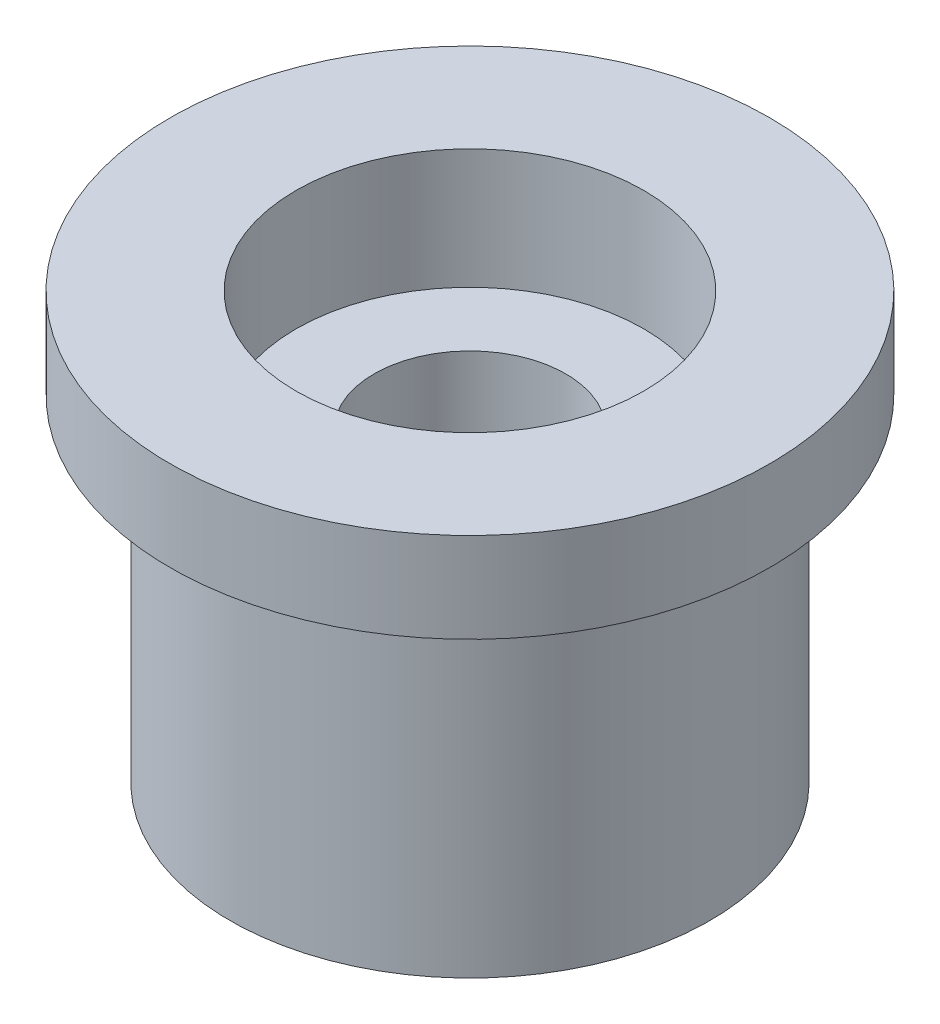
ISO-10303-21;
HEADER;
FILE_DESCRIPTION(('STEP AP214'),'2;1');
FILE_NAME('part.step','',(''),(''),'','','');
FILE_SCHEMA(('AUTOMOTIVE_DESIGN { 1 0 10303 214 1 1 1 1 }'));
ENDSEC;
DATA;
#1=APPLICATION_CONTEXT('core data for automotive mechanical design processes');
#2=APPLICATION_PROTOCOL_DEFINITION('international standard','automotive_design',2000,#1);
#3=PRODUCT_CONTEXT('',#1,'mechanical');
#4=PRODUCT('Part','Part','',(#3));
#5=PRODUCT_RELATED_PRODUCT_CATEGORY('part','',(#4));
#6=PRODUCT_DEFINITION_FORMATION('','',#4);
#7=PRODUCT_DEFINITION_CONTEXT('part definition',#1,'design');
#8=PRODUCT_DEFINITION('design','',#6,#7);
#9=PRODUCT_DEFINITION_SHAPE('','',#8);
#10=(LENGTH_UNIT() NAMED_UNIT(*) SI_UNIT(.MILLI.,.METRE.));
#11=(NAMED_UNIT(*) PLANE_ANGLE_UNIT() SI_UNIT($,.RADIAN.));
#12=(NAMED_UNIT(*) SI_UNIT($,.STERADIAN.) SOLID_ANGLE_UNIT());
#13=UNCERTAINTY_MEASURE_WITH_UNIT(LENGTH_MEASURE(1.E-05),#10,'distance_accuracy_value','');
#14=(GEOMETRIC_REPRESENTATION_CONTEXT(3) GLOBAL_UNCERTAINTY_ASSIGNED_CONTEXT((#13)) GLOBAL_UNIT_ASSIGNED_CONTEXT((#10,
#11,#12)) REPRESENTATION_CONTEXT('',''));
#15=CARTESIAN_POINT('',(0.,0.,0.));
#16=DIRECTION('',(0.,0.,1.));
#17=DIRECTION('',(1.,0.,0.));
#18=AXIS2_PLACEMENT_3D('',#15,#16,#17);
#19=CARTESIAN_POINT('',(0.,5.6,0.));
#20=DIRECTION('',(0.,-1.,0.));
#21=DIRECTION('',(0.,0.,-1.));
#22=AXIS2_PLACEMENT_3D('',#19,#20,#21);
#23=PLANE('',#22);
#24=CARTESIAN_POINT('',(0.,5.6,0.));
#25=DIRECTION('',(0.,-1.,0.));
#26=DIRECTION('',(0.,0.,-1.));
#27=AXIS2_PLACEMENT_3D('',#24,#25,#26);
#28=CIRCLE('',#27,5.);
#29=CARTESIAN_POINT('',(0.,5.6,-5.));
#30=VERTEX_POINT('',#29);
#31=EDGE_CURVE('E41',#30,#30,#28,.T.);
#32=ORIENTED_EDGE('',*,*,#31,.T.);
#33=EDGE_LOOP('',(#32));
#34=FACE_BOUND('',#33,.T.);
#35=CARTESIAN_POINT('',(0.,5.6,0.));
#36=DIRECTION('',(0.,-1.,0.));
#37=DIRECTION('',(0.,0.,-1.));
#38=AXIS2_PLACEMENT_3D('',#35,#36,#37);
#39=CIRCLE('',#38,4.);
#40=CARTESIAN_POINT('',(0.,5.6,-4.));
#41=VERTEX_POINT('',#40);
#42=EDGE_CURVE('E219',#41,#41,#39,.T.);
#43=ORIENTED_EDGE('',*,*,#42,.F.);
#44=EDGE_LOOP('',(#43));
#45=FACE_BOUND('',#44,.T.);
#46=ADVANCED_FACE('F33',(#34,#45),#23,.T.);
#47=CARTESIAN_POINT('',(0.,7.1,0.));
#48=DIRECTION('',(0.,-1.,0.));
#49=DIRECTION('',(0.,0.,-1.));
#50=AXIS2_PLACEMENT_3D('',#47,#48,#49);
#51=CYLINDRICAL_SURFACE('',#50,5.);
#52=CARTESIAN_POINT('',(0.,7.1,0.));
#53=DIRECTION('',(0.,-1.,0.));
#54=DIRECTION('',(0.,0.,-1.));
#55=AXIS2_PLACEMENT_3D('',#52,#53,#54);
#56=CIRCLE('',#55,5.);
#57=CARTESIAN_POINT('',(0.,7.1,-5.));
#58=VERTEX_POINT('',#57);
#59=EDGE_CURVE('E11',#58,#58,#56,.T.);
#60=ORIENTED_EDGE('',*,*,#59,.T.);
#61=EDGE_LOOP('',(#60));
#62=FACE_BOUND('',#61,.T.);
#63=ORIENTED_EDGE('',*,*,#31,.F.);
#64=EDGE_LOOP('',(#63));
#65=FACE_BOUND('',#64,.T.);
#66=ADVANCED_FACE('F35',(#62,#65),#51,.T.);
#67=CARTESIAN_POINT('',(5.,7.1,0.));
#68=DIRECTION('',(0.,1.,0.));
#69=DIRECTION('',(0.,0.,1.));
#70=AXIS2_PLACEMENT_3D('',#67,#68,#69);
#71=PLANE('',#70);
#72=CARTESIAN_POINT('',(0.,7.1,0.));
#73=DIRECTION('',(0.,1.,0.));
#74=DIRECTION('',(0.,0.,1.));
#75=AXIS2_PLACEMENT_3D('',#72,#73,#74);
#76=CIRCLE('',#75,2.9);
#77=CARTESIAN_POINT('',(0.,7.1,2.9));
#78=VERTEX_POINT('',#77);
#79=EDGE_CURVE('E329',#78,#78,#76,.T.);
#80=ORIENTED_EDGE('',*,*,#79,.F.);
#81=EDGE_LOOP('',(#80));
#82=FACE_BOUND('',#81,.T.);
#83=ORIENTED_EDGE('',*,*,#59,.F.);
#84=EDGE_LOOP('',(#83));
#85=FACE_BOUND('',#84,.T.);
#86=ADVANCED_FACE('F236',(#82,#85),#71,.T.);
#87=CARTESIAN_POINT('',(0.,0.,0.));
#88=DIRECTION('',(0.,1.,0.));
#89=DIRECTION('',(0.,0.,1.));
#90=AXIS2_PLACEMENT_3D('',#87,#88,#89);
#91=CYLINDRICAL_SURFACE('',#90,4.);
#92=CARTESIAN_POINT('',(0.,0.,0.));
#93=DIRECTION('',(0.,-1.,0.));
#94=DIRECTION('',(0.,0.,-1.));
#95=AXIS2_PLACEMENT_3D('',#92,#93,#94);
#96=CIRCLE('',#95,4.);
#97=CARTESIAN_POINT('',(0.,0.,-4.));
#98=VERTEX_POINT('',#97);
#99=EDGE_CURVE('E226',#98,#98,#96,.T.);
#100=ORIENTED_EDGE('',*,*,#99,.F.);
#101=EDGE_LOOP('',(#100));
#102=FACE_BOUND('',#101,.T.);
#103=ORIENTED_EDGE('',*,*,#42,.T.);
#104=EDGE_LOOP('',(#103));
#105=FACE_BOUND('',#104,.T.);
#106=ADVANCED_FACE('F242',(#102,#105),#91,.T.);
#107=CARTESIAN_POINT('',(0.,0.,0.));
#108=DIRECTION('',(0.,-1.,0.));
#109=DIRECTION('',(0.,0.,-1.));
#110=AXIS2_PLACEMENT_3D('',#107,#108,#109);
#111=PLANE('',#110);
#112=CARTESIAN_POINT('',(0.,0.,0.));
#113=DIRECTION('',(0.,1.,0.));
#114=DIRECTION('',(0.,0.,1.));
#115=AXIS2_PLACEMENT_3D('',#112,#113,#114);
#116=CIRCLE('',#115,1.60000000000001);
#117=CARTESIAN_POINT('',(0.,0.,1.60000000000001));
#118=VERTEX_POINT('',#117);
#119=EDGE_CURVE('E148',#118,#118,#116,.T.);
#120=ORIENTED_EDGE('',*,*,#119,.T.);
#121=EDGE_LOOP('',(#120));
#122=FACE_BOUND('',#121,.T.);
#123=CARTESIAN_POINT('',(-1.02515075142256E-13,0.,0.));
#124=DIRECTION('',(0.,-1.,0.));
#125=DIRECTION('',(0.,0.,-1.));
#126=AXIS2_PLACEMENT_3D('',#123,#124,#125);
#127=CIRCLE('',#126,3.09999999999998);
#128=CARTESIAN_POINT('',(-1.88345277640779,0.,2.46223590239489));
#129=VERTEX_POINT('',#128);
#130=CARTESIAN_POINT('',(-1.88345277640771,0.,-2.46223590239483));
#131=VERTEX_POINT('',#130);
#132=EDGE_CURVE('E48',#129,#131,#127,.T.);
#133=ORIENTED_EDGE('',*,*,#132,.F.);
#134=DIRECTION('',(-0.500000000000124,0.,0.866025403784367));
#135=VECTOR('',#134,1.);
#136=CARTESIAN_POINT('',(-1.47888532680438,0.,1.76150452459345));
#137=LINE('',#136,#135);
#138=CARTESIAN_POINT('',(-1.47888532680438,0.,1.76150452459345));
#139=VERTEX_POINT('',#138);
#140=EDGE_CURVE('E142',#139,#129,#137,.T.);
#141=ORIENTED_EDGE('',*,*,#140,.F.);
#142=CARTESIAN_POINT('',(-1.02515075142256E-13,0.,0.));
#143=DIRECTION('',(0.,1.,0.));
#144=DIRECTION('',(0.,0.,1.));
#145=AXIS2_PLACEMENT_3D('',#142,#143,#144);
#146=CIRCLE('',#145,2.3);
#147=CARTESIAN_POINT('',(-1.4788853268044,0.,-1.76150452459332));
#148=VERTEX_POINT('',#147);
#149=EDGE_CURVE('E145',#148,#139,#146,.T.);
#150=ORIENTED_EDGE('',*,*,#149,.F.);
#151=DIRECTION('',(0.5,0.,0.866025403784439));
#152=VECTOR('',#151,1.);
#153=CARTESIAN_POINT('',(-1.88345277640771,0.,-2.46223590239483));
#154=LINE('',#153,#152);
#155=EDGE_CURVE('E154',#131,#148,#154,.T.);
#156=ORIENTED_EDGE('',*,*,#155,.F.);
#157=EDGE_LOOP('',(#133,#141,#150,#156));
#158=FACE_BOUND('',#157,.T.);
#159=CARTESIAN_POINT('',(0.,0.,0.));
#160=DIRECTION('',(0.,1.,0.));
#161=DIRECTION('',(0.,0.,1.));
#162=AXIS2_PLACEMENT_3D('',#159,#160,#161);
#163=CIRCLE('',#162,2.3);
#164=CARTESIAN_POINT('',(2.26495033058122,0.,-0.400000000000019));
#165=VERTEX_POINT('',#164);
#166=CARTESIAN_POINT('',(-0.786065003776926,0.,-2.16150452459327));
#167=VERTEX_POINT('',#166);
#168=EDGE_CURVE('E56',#165,#167,#163,.T.);
#169=ORIENTED_EDGE('',*,*,#168,.F.);
#170=DIRECTION('',(-1.,0.,0.));
#171=VECTOR('',#170,1.);
#172=CARTESIAN_POINT('',(3.07408522978788,0.,-0.399999999999992));
#173=LINE('',#172,#171);
#174=CARTESIAN_POINT('',(3.07408522978788,0.,-0.399999999999993));
#175=VERTEX_POINT('',#174);
#176=EDGE_CURVE('E167',#175,#165,#173,.T.);
#177=ORIENTED_EDGE('',*,*,#176,.F.);
#178=CARTESIAN_POINT('',(0.,0.,0.));
#179=DIRECTION('',(0.,-1.,0.));
#180=DIRECTION('',(0.,0.,-1.));
#181=AXIS2_PLACEMENT_3D('',#178,#179,#180);
#182=CIRCLE('',#181,3.1);
#183=CARTESIAN_POINT('',(-1.19063245338013,0.,-2.86223590239484));
#184=VERTEX_POINT('',#183);
#185=EDGE_CURVE('E181',#184,#175,#182,.T.);
#186=ORIENTED_EDGE('',*,*,#185,.F.);
#187=DIRECTION('',(-0.499999999999857,0.,-0.866025403784521));
#188=VECTOR('',#187,1.);
#189=CARTESIAN_POINT('',(-0.786065003776927,0.,-2.16150452459327));
#190=LINE('',#189,#188);
#191=EDGE_CURVE('E178',#167,#184,#190,.T.);
#192=ORIENTED_EDGE('',*,*,#191,.F.);
#193=EDGE_LOOP('',(#169,#177,#186,#192));
#194=FACE_BOUND('',#193,.T.);
#195=CARTESIAN_POINT('',(0.,0.,0.));
#196=DIRECTION('',(0.,-1.,0.));
#197=DIRECTION('',(0.,0.,-1.));
#198=AXIS2_PLACEMENT_3D('',#195,#196,#197);
#199=CIRCLE('',#198,3.1);
#200=CARTESIAN_POINT('',(3.07408522978788,0.,0.399999999999992));
#201=VERTEX_POINT('',#200);
#202=CARTESIAN_POINT('',(-1.19063245337983,0.,2.86223590239497));
#203=VERTEX_POINT('',#202);
#204=EDGE_CURVE('E188',#201,#203,#199,.T.);
#205=ORIENTED_EDGE('',*,*,#204,.F.);
#206=DIRECTION('',(1.,0.,0.));
#207=VECTOR('',#206,1.);
#208=CARTESIAN_POINT('',(2.26495033058122,0.,0.400000000000019));
#209=LINE('',#208,#207);
#210=CARTESIAN_POINT('',(2.26495033058122,0.,0.40000000000002));
#211=VERTEX_POINT('',#210);
#212=EDGE_CURVE('E198',#211,#201,#209,.T.);
#213=ORIENTED_EDGE('',*,*,#212,.F.);
#214=CARTESIAN_POINT('',(0.,0.,0.));
#215=DIRECTION('',(0.,1.,0.));
#216=DIRECTION('',(0.,0.,1.));
#217=AXIS2_PLACEMENT_3D('',#214,#215,#216);
#218=CIRCLE('',#217,2.3);
#219=CARTESIAN_POINT('',(-0.786065003776618,0.,2.16150452459338));
#220=VERTEX_POINT('',#219);
#221=EDGE_CURVE('E212',#220,#211,#218,.T.);
#222=ORIENTED_EDGE('',*,*,#221,.F.);
#223=DIRECTION('',(0.499999999999856,0.,-0.866025403784522));
#224=VECTOR('',#223,1.);
#225=CARTESIAN_POINT('',(-1.19063245337983,0.,2.86223590239497));
#226=LINE('',#225,#224);
#227=EDGE_CURVE('E209',#203,#220,#226,.T.);
#228=ORIENTED_EDGE('',*,*,#227,.F.);
#229=EDGE_LOOP('',(#205,#213,#222,#228));
#230=FACE_BOUND('',#229,.T.);
#231=ORIENTED_EDGE('',*,*,#99,.T.);
#232=EDGE_LOOP('',(#231));
#233=FACE_BOUND('',#232,.T.);
#234=ADVANCED_FACE('F252',(#122,#158,#194,#230,#233),#111,.T.);
#235=CARTESIAN_POINT('',(0.,4.3,0.));
#236=DIRECTION('',(0.,-1.,0.));
#237=DIRECTION('',(0.,0.,-1.));
#238=AXIS2_PLACEMENT_3D('',#235,#236,#237);
#239=CYLINDRICAL_SURFACE('',#238,3.1);
#240=ORIENTED_EDGE('',*,*,#204,.T.);
#241=DIRECTION('',(0.,-1.,0.));
#242=VECTOR('',#241,1.);
#243=CARTESIAN_POINT('',(-1.19063245337983,4.3,2.86223590239497));
#244=LINE('',#243,#242);
#245=CARTESIAN_POINT('',(-1.19063245337983,4.3,2.86223590239497));
#246=VERTEX_POINT('',#245);
#247=EDGE_CURVE('E207',#246,#203,#244,.T.);
#248=ORIENTED_EDGE('',*,*,#247,.F.);
#249=CARTESIAN_POINT('',(0.,4.3,0.));
#250=DIRECTION('',(0.,-1.,0.));
#251=DIRECTION('',(0.,0.,-1.));
#252=AXIS2_PLACEMENT_3D('',#249,#250,#251);
#253=CIRCLE('',#252,3.1);
#254=CARTESIAN_POINT('',(3.07408522978788,4.3,0.399999999999992));
#255=VERTEX_POINT('',#254);
#256=EDGE_CURVE('E194',#255,#246,#253,.T.);
#257=ORIENTED_EDGE('',*,*,#256,.F.);
#258=DIRECTION('',(0.,-1.,0.));
#259=VECTOR('',#258,1.);
#260=CARTESIAN_POINT('',(3.07408522978788,4.3,0.399999999999992));
#261=LINE('',#260,#259);
#262=EDGE_CURVE('E217',#255,#201,#261,.T.);
#263=ORIENTED_EDGE('',*,*,#262,.T.);
#264=EDGE_LOOP('',(#240,#248,#257,#263));
#265=FACE_BOUND('',#264,.T.);
#266=ADVANCED_FACE('F256',(#265),#239,.F.);
#267=CARTESIAN_POINT('',(2.26495033058122,4.3,0.400000000000019));
#268=DIRECTION('',(0.,0.,-1.));
#269=DIRECTION('',(-1.,0.,0.));
#270=AXIS2_PLACEMENT_3D('',#267,#268,#269);
#271=PLANE('',#270);
#272=ORIENTED_EDGE('',*,*,#212,.T.);
#273=ORIENTED_EDGE('',*,*,#262,.F.);
#274=DIRECTION('',(1.,0.,0.));
#275=VECTOR('',#274,1.);
#276=CARTESIAN_POINT('',(2.26495033058122,4.3,0.400000000000019));
#277=LINE('',#276,#275);
#278=CARTESIAN_POINT('',(2.26495033058122,4.3,0.40000000000002));
#279=VERTEX_POINT('',#278);
#280=EDGE_CURVE('E204',#279,#255,#277,.T.);
#281=ORIENTED_EDGE('',*,*,#280,.F.);
#282=DIRECTION('',(0.,-1.,0.));
#283=VECTOR('',#282,1.);
#284=CARTESIAN_POINT('',(2.26495033058122,4.3,0.40000000000002));
#285=LINE('',#284,#283);
#286=EDGE_CURVE('E220',#279,#211,#285,.T.);
#287=ORIENTED_EDGE('',*,*,#286,.T.);
#288=EDGE_LOOP('',(#272,#273,#281,#287));
#289=FACE_BOUND('',#288,.T.);
#290=ADVANCED_FACE('F260',(#289),#271,.F.);
#291=CARTESIAN_POINT('',(0.,4.3,0.));
#292=DIRECTION('',(0.,-1.,0.));
#293=DIRECTION('',(0.,0.,-1.));
#294=AXIS2_PLACEMENT_3D('',#291,#292,#293);
#295=CYLINDRICAL_SURFACE('',#294,2.3);
#296=ORIENTED_EDGE('',*,*,#221,.T.);
#297=ORIENTED_EDGE('',*,*,#286,.F.);
#298=CARTESIAN_POINT('',(0.,4.3,0.));
#299=DIRECTION('',(0.,1.,0.));
#300=DIRECTION('',(0.,0.,1.));
#301=AXIS2_PLACEMENT_3D('',#298,#299,#300);
#302=CIRCLE('',#301,2.3);
#303=CARTESIAN_POINT('',(-0.786065003776618,4.3,2.16150452459338));
#304=VERTEX_POINT('',#303);
#305=EDGE_CURVE('E201',#304,#279,#302,.T.);
#306=ORIENTED_EDGE('',*,*,#305,.F.);
#307=DIRECTION('',(0.,-1.,0.));
#308=VECTOR('',#307,1.);
#309=CARTESIAN_POINT('',(-0.786065003776618,4.3,2.16150452459338));
#310=LINE('',#309,#308);
#311=EDGE_CURVE('E222',#304,#220,#310,.T.);
#312=ORIENTED_EDGE('',*,*,#311,.T.);
#313=EDGE_LOOP('',(#296,#297,#306,#312));
#314=FACE_BOUND('',#313,.T.);
#315=ADVANCED_FACE('F266',(#314),#295,.T.);
#316=CARTESIAN_POINT('',(-1.19063245337983,4.3,2.86223590239497));
#317=DIRECTION('',(-0.866025403784522,0.,-0.499999999999856));
#318=DIRECTION('',(-0.499999999999856,0.,0.866025403784522));
#319=AXIS2_PLACEMENT_3D('',#316,#317,#318);
#320=PLANE('',#319);
#321=ORIENTED_EDGE('',*,*,#227,.T.);
#322=ORIENTED_EDGE('',*,*,#311,.F.);
#323=DIRECTION('',(0.499999999999856,0.,-0.866025403784522));
#324=VECTOR('',#323,1.);
#325=CARTESIAN_POINT('',(-1.19063245337983,4.3,2.86223590239497));
#326=LINE('',#325,#324);
#327=EDGE_CURVE('E197',#246,#304,#326,.T.);
#328=ORIENTED_EDGE('',*,*,#327,.F.);
#329=ORIENTED_EDGE('',*,*,#247,.T.);
#330=EDGE_LOOP('',(#321,#322,#328,#329));
#331=FACE_BOUND('',#330,.T.);
#332=ADVANCED_FACE('F262',(#331),#320,.F.);
#333=CARTESIAN_POINT('',(0.,4.3,0.));
#334=DIRECTION('',(0.,-1.,0.));
#335=DIRECTION('',(0.,0.,-1.));
#336=AXIS2_PLACEMENT_3D('',#333,#334,#335);
#337=PLANE('',#336);
#338=ORIENTED_EDGE('',*,*,#256,.T.);
#339=ORIENTED_EDGE('',*,*,#327,.T.);
#340=ORIENTED_EDGE('',*,*,#305,.T.);
#341=ORIENTED_EDGE('',*,*,#280,.T.);
#342=EDGE_LOOP('',(#338,#339,#340,#341));
#343=FACE_BOUND('',#342,.T.);
#344=ADVANCED_FACE('F265',(#343),#337,.T.);
#345=CARTESIAN_POINT('',(0.,4.3,0.));
#346=DIRECTION('',(0.,-1.,0.));
#347=DIRECTION('',(0.,0.,-1.));
#348=AXIS2_PLACEMENT_3D('',#345,#346,#347);
#349=CYLINDRICAL_SURFACE('',#348,2.3);
#350=ORIENTED_EDGE('',*,*,#168,.T.);
#351=DIRECTION('',(0.,-1.,0.));
#352=VECTOR('',#351,1.);
#353=CARTESIAN_POINT('',(-0.786065003776927,4.3,-2.16150452459327));
#354=LINE('',#353,#352);
#355=CARTESIAN_POINT('',(-0.786065003776927,4.3,-2.16150452459327));
#356=VERTEX_POINT('',#355);
#357=EDGE_CURVE('E176',#356,#167,#354,.T.);
#358=ORIENTED_EDGE('',*,*,#357,.F.);
#359=CARTESIAN_POINT('',(0.,4.3,0.));
#360=DIRECTION('',(0.,1.,0.));
#361=DIRECTION('',(0.,0.,1.));
#362=AXIS2_PLACEMENT_3D('',#359,#360,#361);
#363=CIRCLE('',#362,2.3);
#364=CARTESIAN_POINT('',(2.26495033058122,4.3,-0.400000000000019));
#365=VERTEX_POINT('',#364);
#366=EDGE_CURVE('E163',#365,#356,#363,.T.);
#367=ORIENTED_EDGE('',*,*,#366,.F.);
#368=DIRECTION('',(0.,-1.,0.));
#369=VECTOR('',#368,1.);
#370=CARTESIAN_POINT('',(2.26495033058122,4.3,-0.400000000000019));
#371=LINE('',#370,#369);
#372=EDGE_CURVE('E186',#365,#165,#371,.T.);
#373=ORIENTED_EDGE('',*,*,#372,.T.);
#374=EDGE_LOOP('',(#350,#358,#367,#373));
#375=FACE_BOUND('',#374,.T.);
#376=ADVANCED_FACE('F276',(#375),#349,.T.);
#377=CARTESIAN_POINT('',(3.07408522978788,4.3,-0.399999999999992));
#378=DIRECTION('',(0.,0.,1.));
#379=DIRECTION('',(1.,0.,0.));
#380=AXIS2_PLACEMENT_3D('',#377,#378,#379);
#381=PLANE('',#380);
#382=ORIENTED_EDGE('',*,*,#176,.T.);
#383=ORIENTED_EDGE('',*,*,#372,.F.);
#384=DIRECTION('',(-1.,0.,0.));
#385=VECTOR('',#384,1.);
#386=CARTESIAN_POINT('',(3.07408522978788,4.3,-0.399999999999992));
#387=LINE('',#386,#385);
#388=CARTESIAN_POINT('',(3.07408522978788,4.3,-0.399999999999993));
#389=VERTEX_POINT('',#388);
#390=EDGE_CURVE('E173',#389,#365,#387,.T.);
#391=ORIENTED_EDGE('',*,*,#390,.F.);
#392=DIRECTION('',(0.,-1.,0.));
#393=VECTOR('',#392,1.);
#394=CARTESIAN_POINT('',(3.07408522978788,4.3,-0.399999999999993));
#395=LINE('',#394,#393);
#396=EDGE_CURVE('E189',#389,#175,#395,.T.);
#397=ORIENTED_EDGE('',*,*,#396,.T.);
#398=EDGE_LOOP('',(#382,#383,#391,#397));
#399=FACE_BOUND('',#398,.T.);
#400=ADVANCED_FACE('F280',(#399),#381,.F.);
#401=CARTESIAN_POINT('',(0.,4.3,0.));
#402=DIRECTION('',(0.,-1.,0.));
#403=DIRECTION('',(0.,0.,-1.));
#404=AXIS2_PLACEMENT_3D('',#401,#402,#403);
#405=CYLINDRICAL_SURFACE('',#404,3.1);
#406=ORIENTED_EDGE('',*,*,#185,.T.);
#407=ORIENTED_EDGE('',*,*,#396,.F.);
#408=CARTESIAN_POINT('',(0.,4.3,0.));
#409=DIRECTION('',(0.,-1.,0.));
#410=DIRECTION('',(0.,0.,-1.));
#411=AXIS2_PLACEMENT_3D('',#408,#409,#410);
#412=CIRCLE('',#411,3.1);
#413=CARTESIAN_POINT('',(-1.19063245338013,4.3,-2.86223590239484));
#414=VERTEX_POINT('',#413);
#415=EDGE_CURVE('E170',#414,#389,#412,.T.);
#416=ORIENTED_EDGE('',*,*,#415,.F.);
#417=DIRECTION('',(0.,-1.,0.));
#418=VECTOR('',#417,1.);
#419=CARTESIAN_POINT('',(-1.19063245338013,4.3,-2.86223590239484));
#420=LINE('',#419,#418);
#421=EDGE_CURVE('E191',#414,#184,#420,.T.);
#422=ORIENTED_EDGE('',*,*,#421,.T.);
#423=EDGE_LOOP('',(#406,#407,#416,#422));
#424=FACE_BOUND('',#423,.T.);
#425=ADVANCED_FACE('F285',(#424),#405,.F.);
#426=CARTESIAN_POINT('',(-0.786065003776927,4.3,-2.16150452459327));
#427=DIRECTION('',(-0.866025403784521,0.,0.499999999999857));
#428=DIRECTION('',(0.499999999999857,0.,0.866025403784521));
#429=AXIS2_PLACEMENT_3D('',#426,#427,#428);
#430=PLANE('',#429);
#431=ORIENTED_EDGE('',*,*,#191,.T.);
#432=ORIENTED_EDGE('',*,*,#421,.F.);
#433=DIRECTION('',(-0.499999999999857,0.,-0.866025403784521));
#434=VECTOR('',#433,1.);
#435=CARTESIAN_POINT('',(-0.786065003776927,4.3,-2.16150452459327));
#436=LINE('',#435,#434);
#437=EDGE_CURVE('E166',#356,#414,#436,.T.);
#438=ORIENTED_EDGE('',*,*,#437,.F.);
#439=ORIENTED_EDGE('',*,*,#357,.T.);
#440=EDGE_LOOP('',(#431,#432,#438,#439));
#441=FACE_BOUND('',#440,.T.);
#442=ADVANCED_FACE('F281',(#441),#430,.F.);
#443=CARTESIAN_POINT('',(0.,4.3,0.));
#444=DIRECTION('',(0.,1.,0.));
#445=DIRECTION('',(0.,0.,1.));
#446=AXIS2_PLACEMENT_3D('',#443,#444,#445);
#447=PLANE('',#446);
#448=ORIENTED_EDGE('',*,*,#366,.T.);
#449=ORIENTED_EDGE('',*,*,#437,.T.);
#450=ORIENTED_EDGE('',*,*,#415,.T.);
#451=ORIENTED_EDGE('',*,*,#390,.T.);
#452=EDGE_LOOP('',(#448,#449,#450,#451));
#453=FACE_BOUND('',#452,.T.);
#454=ADVANCED_FACE('F284',(#453),#447,.F.);
#455=CARTESIAN_POINT('',(-1.02515075142256E-13,4.3,0.));
#456=DIRECTION('',(0.,-1.,0.));
#457=DIRECTION('',(0.,0.,-1.));
#458=AXIS2_PLACEMENT_3D('',#455,#456,#457);
#459=CYLINDRICAL_SURFACE('',#458,3.09999999999998);
#460=ORIENTED_EDGE('',*,*,#132,.T.);
#461=DIRECTION('',(0.,-1.,0.));
#462=VECTOR('',#461,1.);
#463=CARTESIAN_POINT('',(-1.88345277640771,4.3,-2.46223590239483));
#464=LINE('',#463,#462);
#465=CARTESIAN_POINT('',(-1.88345277640771,4.3,-2.46223590239483));
#466=VERTEX_POINT('',#465);
#467=EDGE_CURVE('E120',#466,#131,#464,.T.);
#468=ORIENTED_EDGE('',*,*,#467,.F.);
#469=CARTESIAN_POINT('',(-1.02515075142256E-13,4.3,0.));
#470=DIRECTION('',(0.,-1.,0.));
#471=DIRECTION('',(0.,0.,-1.));
#472=AXIS2_PLACEMENT_3D('',#469,#470,#471);
#473=CIRCLE('',#472,3.09999999999998);
#474=CARTESIAN_POINT('',(-1.88345277640779,4.3,2.46223590239489));
#475=VERTEX_POINT('',#474);
#476=EDGE_CURVE('E124',#475,#466,#473,.T.);
#477=ORIENTED_EDGE('',*,*,#476,.F.);
#478=DIRECTION('',(0.,-1.,0.));
#479=VECTOR('',#478,1.);
#480=CARTESIAN_POINT('',(-1.88345277640779,4.3,2.46223590239489));
#481=LINE('',#480,#479);
#482=EDGE_CURVE('E158',#475,#129,#481,.T.);
#483=ORIENTED_EDGE('',*,*,#482,.T.);
#484=EDGE_LOOP('',(#460,#468,#477,#483));
#485=FACE_BOUND('',#484,.T.);
#486=ADVANCED_FACE('F122',(#485),#459,.F.);
#487=CARTESIAN_POINT('',(-1.47888532680438,4.3,1.76150452459345));
#488=DIRECTION('',(0.866025403784367,0.,0.500000000000124));
#489=DIRECTION('',(0.500000000000124,0.,-0.866025403784367));
#490=AXIS2_PLACEMENT_3D('',#487,#488,#489);
#491=PLANE('',#490);
#492=ORIENTED_EDGE('',*,*,#140,.T.);
#493=ORIENTED_EDGE('',*,*,#482,.F.);
#494=DIRECTION('',(-0.500000000000124,0.,0.866025403784367));
#495=VECTOR('',#494,1.);
#496=CARTESIAN_POINT('',(-1.47888532680438,4.3,1.76150452459345));
#497=LINE('',#496,#495);
#498=CARTESIAN_POINT('',(-1.47888532680438,4.3,1.76150452459345));
#499=VERTEX_POINT('',#498);
#500=EDGE_CURVE('E130',#499,#475,#497,.T.);
#501=ORIENTED_EDGE('',*,*,#500,.F.);
#502=DIRECTION('',(0.,-1.,0.));
#503=VECTOR('',#502,1.);
#504=CARTESIAN_POINT('',(-1.47888532680438,4.3,1.76150452459345));
#505=LINE('',#504,#503);
#506=EDGE_CURVE('E160',#499,#139,#505,.T.);
#507=ORIENTED_EDGE('',*,*,#506,.T.);
#508=EDGE_LOOP('',(#492,#493,#501,#507));
#509=FACE_BOUND('',#508,.T.);
#510=ADVANCED_FACE('F298',(#509),#491,.F.);
#511=CARTESIAN_POINT('',(-1.02515075142256E-13,4.3,0.));
#512=DIRECTION('',(0.,-1.,0.));
#513=DIRECTION('',(0.,0.,-1.));
#514=AXIS2_PLACEMENT_3D('',#511,#512,#513);
#515=CYLINDRICAL_SURFACE('',#514,2.3);
#516=ORIENTED_EDGE('',*,*,#149,.T.);
#517=ORIENTED_EDGE('',*,*,#506,.F.);
#518=CARTESIAN_POINT('',(-1.02515075142256E-13,4.3,0.));
#519=DIRECTION('',(0.,1.,0.));
#520=DIRECTION('',(0.,0.,1.));
#521=AXIS2_PLACEMENT_3D('',#518,#519,#520);
#522=CIRCLE('',#521,2.3);
#523=CARTESIAN_POINT('',(-1.4788853268044,4.3,-1.76150452459332));
#524=VERTEX_POINT('',#523);
#525=EDGE_CURVE('E138',#524,#499,#522,.T.);
#526=ORIENTED_EDGE('',*,*,#525,.F.);
#527=DIRECTION('',(0.,-1.,0.));
#528=VECTOR('',#527,1.);
#529=CARTESIAN_POINT('',(-1.4788853268044,4.3,-1.76150452459332));
#530=LINE('',#529,#528);
#531=EDGE_CURVE('E129',#524,#148,#530,.T.);
#532=ORIENTED_EDGE('',*,*,#531,.T.);
#533=EDGE_LOOP('',(#516,#517,#526,#532));
#534=FACE_BOUND('',#533,.T.);
#535=ADVANCED_FACE('F301',(#534),#515,.T.);
#536=CARTESIAN_POINT('',(-1.88345277640771,4.3,-2.46223590239483));
#537=DIRECTION('',(0.866025403784438,0.,-0.5));
#538=DIRECTION('',(-0.5,0.,-0.866025403784439));
#539=AXIS2_PLACEMENT_3D('',#536,#537,#538);
#540=PLANE('',#539);
#541=ORIENTED_EDGE('',*,*,#155,.T.);
#542=ORIENTED_EDGE('',*,*,#531,.F.);
#543=DIRECTION('',(0.5,0.,0.866025403784439));
#544=VECTOR('',#543,1.);
#545=CARTESIAN_POINT('',(-1.88345277640771,4.3,-2.46223590239483));
#546=LINE('',#545,#544);
#547=EDGE_CURVE('E133',#466,#524,#546,.T.);
#548=ORIENTED_EDGE('',*,*,#547,.F.);
#549=ORIENTED_EDGE('',*,*,#467,.T.);
#550=EDGE_LOOP('',(#541,#542,#548,#549));
#551=FACE_BOUND('',#550,.T.);
#552=ADVANCED_FACE('F134',(#551),#540,.F.);
#553=CARTESIAN_POINT('',(-1.02515075142256E-13,4.3,0.));
#554=DIRECTION('',(0.,-1.,0.));
#555=DIRECTION('',(0.,0.,-1.));
#556=AXIS2_PLACEMENT_3D('',#553,#554,#555);
#557=PLANE('',#556);
#558=ORIENTED_EDGE('',*,*,#476,.T.);
#559=ORIENTED_EDGE('',*,*,#547,.T.);
#560=ORIENTED_EDGE('',*,*,#525,.T.);
#561=ORIENTED_EDGE('',*,*,#500,.T.);
#562=EDGE_LOOP('',(#558,#559,#560,#561));
#563=FACE_BOUND('',#562,.T.);
#564=ADVANCED_FACE('F140',(#563),#557,.T.);
#565=CARTESIAN_POINT('',(0.,7.1,0.));
#566=DIRECTION('',(0.,1.,0.));
#567=DIRECTION('',(0.,0.,1.));
#568=AXIS2_PLACEMENT_3D('',#565,#566,#567);
#569=CYLINDRICAL_SURFACE('',#568,1.60000000000001);
#570=ORIENTED_EDGE('',*,*,#119,.F.);
#571=EDGE_LOOP('',(#570));
#572=FACE_BOUND('',#571,.T.);
#573=CARTESIAN_POINT('',(0.,5.1,0.));
#574=DIRECTION('',(0.,1.,0.));
#575=DIRECTION('',(0.,0.,1.));
#576=AXIS2_PLACEMENT_3D('',#573,#574,#575);
#577=CIRCLE('',#576,1.60000000000001);
#578=CARTESIAN_POINT('',(0.,5.1,1.60000000000001));
#579=VERTEX_POINT('',#578);
#580=EDGE_CURVE('E331',#579,#579,#577,.T.);
#581=ORIENTED_EDGE('',*,*,#580,.T.);
#582=EDGE_LOOP('',(#581));
#583=FACE_BOUND('',#582,.T.);
#584=ADVANCED_FACE('F310',(#572,#583),#569,.F.);
#585=CARTESIAN_POINT('',(1.60000000000001,5.1,0.));
#586=DIRECTION('',(0.,-1.,0.));
#587=DIRECTION('',(0.,0.,-1.));
#588=AXIS2_PLACEMENT_3D('',#585,#586,#587);
#589=PLANE('',#588);
#590=ORIENTED_EDGE('',*,*,#580,.F.);
#591=EDGE_LOOP('',(#590));
#592=FACE_BOUND('',#591,.T.);
#593=CARTESIAN_POINT('',(0.,5.1,0.));
#594=DIRECTION('',(0.,1.,0.));
#595=DIRECTION('',(0.,0.,1.));
#596=AXIS2_PLACEMENT_3D('',#593,#594,#595);
#597=CIRCLE('',#596,2.9);
#598=CARTESIAN_POINT('',(0.,5.1,2.9));
#599=VERTEX_POINT('',#598);
#600=EDGE_CURVE('E326',#599,#599,#597,.T.);
#601=ORIENTED_EDGE('',*,*,#600,.T.);
#602=EDGE_LOOP('',(#601));
#603=FACE_BOUND('',#602,.T.);
#604=ADVANCED_FACE('F313',(#592,#603),#589,.F.);
#605=CARTESIAN_POINT('',(0.,7.1,0.));
#606=DIRECTION('',(0.,1.,0.));
#607=DIRECTION('',(0.,0.,1.));
#608=AXIS2_PLACEMENT_3D('',#605,#606,#607);
#609=CYLINDRICAL_SURFACE('',#608,2.9);
#610=ORIENTED_EDGE('',*,*,#600,.F.);
#611=EDGE_LOOP('',(#610));
#612=FACE_BOUND('',#611,.T.);
#613=ORIENTED_EDGE('',*,*,#79,.T.);
#614=EDGE_LOOP('',(#613));
#615=FACE_BOUND('',#614,.T.);
#616=ADVANCED_FACE('F317',(#612,#615),#609,.F.);
#617=CLOSED_SHELL('',(#46,#66,#86,#106,#234,#266,#290,#315,#332,#344,#376,#400,#425,#442,#454,
#486,#510,#535,#552,#564,#584,#604,#616));
#618=MANIFOLD_SOLID_BREP('B2',#617);
#619=ADVANCED_BREP_SHAPE_REPRESENTATION('',(#18,#618),#14);
#620=SHAPE_DEFINITION_REPRESENTATION(#9,#619);
ENDSEC;
END-ISO-10303-21;
